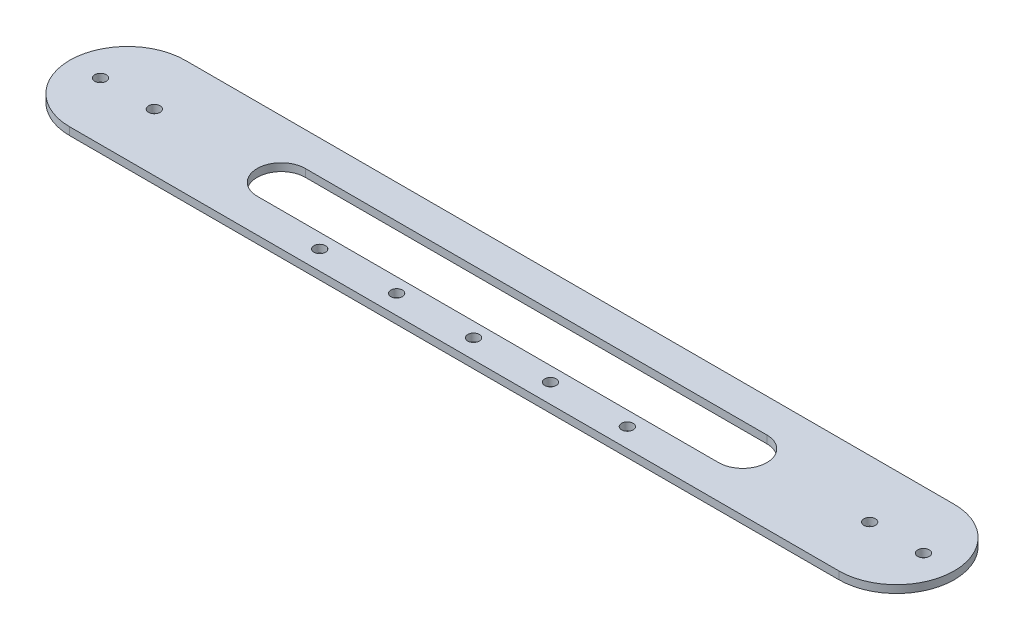
ISO-10303-21;
HEADER;
FILE_DESCRIPTION(('STEP AP214'),'2;1');
FILE_NAME('part.step','',(''),(''),'','','');
FILE_SCHEMA(('AUTOMOTIVE_DESIGN { 1 0 10303 214 1 1 1 1 }'));
ENDSEC;
DATA;
#1=APPLICATION_CONTEXT('core data for automotive mechanical design processes');
#2=APPLICATION_PROTOCOL_DEFINITION('international standard','automotive_design',2000,#1);
#3=PRODUCT_CONTEXT('',#1,'mechanical');
#4=PRODUCT('Part','Part','',(#3));
#5=PRODUCT_RELATED_PRODUCT_CATEGORY('part','',(#4));
#6=PRODUCT_DEFINITION_FORMATION('','',#4);
#7=PRODUCT_DEFINITION_CONTEXT('part definition',#1,'design');
#8=PRODUCT_DEFINITION('design','',#6,#7);
#9=PRODUCT_DEFINITION_SHAPE('','',#8);
#10=(LENGTH_UNIT() NAMED_UNIT(*) SI_UNIT(.MILLI.,.METRE.));
#11=(NAMED_UNIT(*) PLANE_ANGLE_UNIT() SI_UNIT($,.RADIAN.));
#12=(NAMED_UNIT(*) SI_UNIT($,.STERADIAN.) SOLID_ANGLE_UNIT());
#13=UNCERTAINTY_MEASURE_WITH_UNIT(LENGTH_MEASURE(1.E-05),#10,'distance_accuracy_value','');
#14=(GEOMETRIC_REPRESENTATION_CONTEXT(3) GLOBAL_UNCERTAINTY_ASSIGNED_CONTEXT((#13)) GLOBAL_UNIT_ASSIGNED_CONTEXT((#10,
#11,#12)) REPRESENTATION_CONTEXT('',''));
#15=CARTESIAN_POINT('',(0.,0.,0.));
#16=DIRECTION('',(0.,0.,1.));
#17=DIRECTION('',(1.,0.,0.));
#18=AXIS2_PLACEMENT_3D('',#15,#16,#17);
#19=CARTESIAN_POINT('',(-100.,2.,0.));
#20=DIRECTION('',(0.,-1.,0.));
#21=DIRECTION('',(0.,0.,-1.));
#22=AXIS2_PLACEMENT_3D('',#19,#20,#21);
#23=CYLINDRICAL_SURFACE('',#22,15.);
#24=CARTESIAN_POINT('',(-100.,0.,0.));
#25=DIRECTION('',(0.,1.,0.));
#26=DIRECTION('',(0.,0.,1.));
#27=AXIS2_PLACEMENT_3D('',#24,#25,#26);
#28=CIRCLE('',#27,15.);
#29=CARTESIAN_POINT('',(-100.,0.,-15.));
#30=VERTEX_POINT('',#29);
#31=CARTESIAN_POINT('',(-100.,0.,15.));
#32=VERTEX_POINT('',#31);
#33=EDGE_CURVE('E219',#30,#32,#28,.T.);
#34=ORIENTED_EDGE('',*,*,#33,.T.);
#35=DIRECTION('',(0.,-1.,0.));
#36=VECTOR('',#35,1.);
#37=CARTESIAN_POINT('',(-100.,2.,15.));
#38=LINE('',#37,#36);
#39=CARTESIAN_POINT('',(-100.,2.,15.));
#40=VERTEX_POINT('',#39);
#41=EDGE_CURVE('E11',#40,#32,#38,.T.);
#42=ORIENTED_EDGE('',*,*,#41,.F.);
#43=CARTESIAN_POINT('',(-100.,2.,0.));
#44=DIRECTION('',(0.,1.,0.));
#45=DIRECTION('',(0.,0.,1.));
#46=AXIS2_PLACEMENT_3D('',#43,#44,#45);
#47=CIRCLE('',#46,15.);
#48=CARTESIAN_POINT('',(-100.,2.,-15.));
#49=VERTEX_POINT('',#48);
#50=EDGE_CURVE('E204',#49,#40,#47,.T.);
#51=ORIENTED_EDGE('',*,*,#50,.F.);
#52=DIRECTION('',(0.,-1.,0.));
#53=VECTOR('',#52,1.);
#54=CARTESIAN_POINT('',(-100.,2.,-15.));
#55=LINE('',#54,#53);
#56=EDGE_CURVE('E218',#49,#30,#55,.T.);
#57=ORIENTED_EDGE('',*,*,#56,.T.);
#58=EDGE_LOOP('',(#34,#42,#51,#57));
#59=FACE_BOUND('',#58,.T.);
#60=ADVANCED_FACE('F43',(#59),#23,.T.);
#61=CARTESIAN_POINT('',(-100.,2.,15.));
#62=DIRECTION('',(0.,0.,-1.));
#63=DIRECTION('',(-1.,0.,0.));
#64=AXIS2_PLACEMENT_3D('',#61,#62,#63);
#65=PLANE('',#64);
#66=DIRECTION('',(1.,0.,0.));
#67=VECTOR('',#66,1.);
#68=CARTESIAN_POINT('',(-100.,0.,15.));
#69=LINE('',#68,#67);
#70=CARTESIAN_POINT('',(100.,0.,15.));
#71=VERTEX_POINT('',#70);
#72=EDGE_CURVE('E223',#32,#71,#69,.T.);
#73=ORIENTED_EDGE('',*,*,#72,.T.);
#74=DIRECTION('',(0.,-1.,0.));
#75=VECTOR('',#74,1.);
#76=CARTESIAN_POINT('',(100.,2.,15.));
#77=LINE('',#76,#75);
#78=CARTESIAN_POINT('',(100.,2.,15.));
#79=VERTEX_POINT('',#78);
#80=EDGE_CURVE('E51',#79,#71,#77,.T.);
#81=ORIENTED_EDGE('',*,*,#80,.F.);
#82=DIRECTION('',(1.,0.,0.));
#83=VECTOR('',#82,1.);
#84=CARTESIAN_POINT('',(-100.,2.,15.));
#85=LINE('',#84,#83);
#86=EDGE_CURVE('E208',#40,#79,#85,.T.);
#87=ORIENTED_EDGE('',*,*,#86,.F.);
#88=ORIENTED_EDGE('',*,*,#41,.T.);
#89=EDGE_LOOP('',(#73,#81,#87,#88));
#90=FACE_BOUND('',#89,.T.);
#91=ADVANCED_FACE('F258',(#90),#65,.F.);
#92=CARTESIAN_POINT('',(100.,2.,0.));
#93=DIRECTION('',(0.,-1.,0.));
#94=DIRECTION('',(0.,0.,-1.));
#95=AXIS2_PLACEMENT_3D('',#92,#93,#94);
#96=CYLINDRICAL_SURFACE('',#95,15.);
#97=CARTESIAN_POINT('',(100.,0.,0.));
#98=DIRECTION('',(0.,1.,0.));
#99=DIRECTION('',(0.,0.,1.));
#100=AXIS2_PLACEMENT_3D('',#97,#98,#99);
#101=CIRCLE('',#100,15.);
#102=CARTESIAN_POINT('',(100.,0.,-15.));
#103=VERTEX_POINT('',#102);
#104=EDGE_CURVE('E227',#71,#103,#101,.T.);
#105=ORIENTED_EDGE('',*,*,#104,.T.);
#106=DIRECTION('',(0.,-1.,0.));
#107=VECTOR('',#106,1.);
#108=CARTESIAN_POINT('',(100.,2.,-15.));
#109=LINE('',#108,#107);
#110=CARTESIAN_POINT('',(100.,2.,-15.));
#111=VERTEX_POINT('',#110);
#112=EDGE_CURVE('E235',#111,#103,#109,.T.);
#113=ORIENTED_EDGE('',*,*,#112,.F.);
#114=CARTESIAN_POINT('',(100.,2.,0.));
#115=DIRECTION('',(0.,1.,0.));
#116=DIRECTION('',(0.,0.,1.));
#117=AXIS2_PLACEMENT_3D('',#114,#115,#116);
#118=CIRCLE('',#117,15.);
#119=EDGE_CURVE('E212',#79,#111,#118,.T.);
#120=ORIENTED_EDGE('',*,*,#119,.F.);
#121=ORIENTED_EDGE('',*,*,#80,.T.);
#122=EDGE_LOOP('',(#105,#113,#120,#121));
#123=FACE_BOUND('',#122,.T.);
#124=ADVANCED_FACE('F244',(#123),#96,.T.);
#125=CARTESIAN_POINT('',(-100.,2.,-15.));
#126=DIRECTION('',(0.,0.,1.));
#127=DIRECTION('',(1.,0.,0.));
#128=AXIS2_PLACEMENT_3D('',#125,#126,#127);
#129=PLANE('',#128);
#130=DIRECTION('',(-1.,0.,0.));
#131=VECTOR('',#130,1.);
#132=CARTESIAN_POINT('',(-100.,0.,-15.));
#133=LINE('',#132,#131);
#134=EDGE_CURVE('E209',#103,#30,#133,.T.);
#135=ORIENTED_EDGE('',*,*,#134,.T.);
#136=ORIENTED_EDGE('',*,*,#56,.F.);
#137=DIRECTION('',(-1.,0.,0.));
#138=VECTOR('',#137,1.);
#139=CARTESIAN_POINT('',(-100.,2.,-15.));
#140=LINE('',#139,#138);
#141=EDGE_CURVE('E215',#111,#49,#140,.T.);
#142=ORIENTED_EDGE('',*,*,#141,.F.);
#143=ORIENTED_EDGE('',*,*,#112,.T.);
#144=EDGE_LOOP('',(#135,#136,#142,#143));
#145=FACE_BOUND('',#144,.T.);
#146=ADVANCED_FACE('F253',(#145),#129,.F.);
#147=CARTESIAN_POINT('',(-100.,2.,0.));
#148=DIRECTION('',(0.,1.,0.));
#149=DIRECTION('',(0.,0.,1.));
#150=AXIS2_PLACEMENT_3D('',#147,#148,#149);
#151=PLANE('',#150);
#152=CARTESIAN_POINT('',(-107.,2.,0.));
#153=DIRECTION('',(0.,1.,0.));
#154=DIRECTION('',(0.,0.,1.));
#155=AXIS2_PLACEMENT_3D('',#152,#153,#154);
#156=CIRCLE('',#155,1.5);
#157=CARTESIAN_POINT('',(-107.,2.,1.5));
#158=VERTEX_POINT('',#157);
#159=EDGE_CURVE('E159',#158,#158,#156,.T.);
#160=ORIENTED_EDGE('',*,*,#159,.F.);
#161=EDGE_LOOP('',(#160));
#162=FACE_BOUND('',#161,.T.);
#163=CARTESIAN_POINT('',(-40.,2.,10.));
#164=DIRECTION('',(0.,1.,0.));
#165=DIRECTION('',(0.,0.,1.));
#166=AXIS2_PLACEMENT_3D('',#163,#164,#165);
#167=CIRCLE('',#166,1.5);
#168=CARTESIAN_POINT('',(-40.,2.,11.5));
#169=VERTEX_POINT('',#168);
#170=EDGE_CURVE('E189',#169,#169,#167,.T.);
#171=ORIENTED_EDGE('',*,*,#170,.F.);
#172=EDGE_LOOP('',(#171));
#173=FACE_BOUND('',#172,.T.);
#174=CARTESIAN_POINT('',(0.,2.,10.));
#175=DIRECTION('',(0.,1.,0.));
#176=DIRECTION('',(0.,0.,1.));
#177=AXIS2_PLACEMENT_3D('',#174,#175,#176);
#178=CIRCLE('',#177,1.5);
#179=CARTESIAN_POINT('',(0.,2.,11.5));
#180=VERTEX_POINT('',#179);
#181=EDGE_CURVE('E116',#180,#180,#178,.T.);
#182=ORIENTED_EDGE('',*,*,#181,.F.);
#183=EDGE_LOOP('',(#182));
#184=FACE_BOUND('',#183,.T.);
#185=CARTESIAN_POINT('',(20.,2.,10.));
#186=DIRECTION('',(0.,1.,0.));
#187=DIRECTION('',(0.,0.,1.));
#188=AXIS2_PLACEMENT_3D('',#185,#186,#187);
#189=CIRCLE('',#188,1.5);
#190=CARTESIAN_POINT('',(20.,2.,11.5));
#191=VERTEX_POINT('',#190);
#192=EDGE_CURVE('E197',#191,#191,#189,.T.);
#193=ORIENTED_EDGE('',*,*,#192,.F.);
#194=EDGE_LOOP('',(#193));
#195=FACE_BOUND('',#194,.T.);
#196=CARTESIAN_POINT('',(40.,2.,9.99999999999999));
#197=DIRECTION('',(0.,1.,0.));
#198=DIRECTION('',(0.,0.,1.));
#199=AXIS2_PLACEMENT_3D('',#196,#197,#198);
#200=CIRCLE('',#199,1.5);
#201=CARTESIAN_POINT('',(40.,2.,11.5));
#202=VERTEX_POINT('',#201);
#203=EDGE_CURVE('E172',#202,#202,#200,.T.);
#204=ORIENTED_EDGE('',*,*,#203,.F.);
#205=EDGE_LOOP('',(#204));
#206=FACE_BOUND('',#205,.T.);
#207=CARTESIAN_POINT('',(-20.,2.,10.));
#208=DIRECTION('',(0.,1.,0.));
#209=DIRECTION('',(0.,0.,1.));
#210=AXIS2_PLACEMENT_3D('',#207,#208,#209);
#211=CIRCLE('',#210,1.5);
#212=CARTESIAN_POINT('',(-20.,2.,11.5));
#213=VERTEX_POINT('',#212);
#214=EDGE_CURVE('E181',#213,#213,#211,.T.);
#215=ORIENTED_EDGE('',*,*,#214,.F.);
#216=EDGE_LOOP('',(#215));
#217=FACE_BOUND('',#216,.T.);
#218=CARTESIAN_POINT('',(-93.,2.,0.));
#219=DIRECTION('',(0.,1.,0.));
#220=DIRECTION('',(0.,0.,1.));
#221=AXIS2_PLACEMENT_3D('',#218,#219,#220);
#222=CIRCLE('',#221,1.5);
#223=CARTESIAN_POINT('',(-93.,2.,1.5));
#224=VERTEX_POINT('',#223);
#225=EDGE_CURVE('E155',#224,#224,#222,.T.);
#226=ORIENTED_EDGE('',*,*,#225,.F.);
#227=EDGE_LOOP('',(#226));
#228=FACE_BOUND('',#227,.T.);
#229=CARTESIAN_POINT('',(107.,2.,0.));
#230=DIRECTION('',(0.,1.,0.));
#231=DIRECTION('',(0.,0.,-1.));
#232=AXIS2_PLACEMENT_3D('',#229,#230,#231);
#233=CIRCLE('',#232,1.5);
#234=CARTESIAN_POINT('',(107.,2.,-1.5));
#235=VERTEX_POINT('',#234);
#236=EDGE_CURVE('E164',#235,#235,#233,.T.);
#237=ORIENTED_EDGE('',*,*,#236,.F.);
#238=EDGE_LOOP('',(#237));
#239=FACE_BOUND('',#238,.T.);
#240=CARTESIAN_POINT('',(93.,2.,0.));
#241=DIRECTION('',(0.,1.,0.));
#242=DIRECTION('',(0.,0.,-1.));
#243=AXIS2_PLACEMENT_3D('',#240,#241,#242);
#244=CIRCLE('',#243,1.5);
#245=CARTESIAN_POINT('',(93.,2.,-1.5));
#246=VERTEX_POINT('',#245);
#247=EDGE_CURVE('E138',#246,#246,#244,.T.);
#248=ORIENTED_EDGE('',*,*,#247,.F.);
#249=EDGE_LOOP('',(#248));
#250=FACE_BOUND('',#249,.T.);
#251=CARTESIAN_POINT('',(-60.,2.,0.));
#252=DIRECTION('',(0.,1.,0.));
#253=DIRECTION('',(0.,0.,1.));
#254=AXIS2_PLACEMENT_3D('',#251,#252,#253);
#255=CIRCLE('',#254,6.25);
#256=CARTESIAN_POINT('',(-60.,2.,-6.25000000000001));
#257=VERTEX_POINT('',#256);
#258=CARTESIAN_POINT('',(-60.,2.,6.24999999999999));
#259=VERTEX_POINT('',#258);
#260=EDGE_CURVE('E58',#257,#259,#255,.T.);
#261=ORIENTED_EDGE('',*,*,#260,.F.);
#262=DIRECTION('',(-1.,0.,0.));
#263=VECTOR('',#262,1.);
#264=CARTESIAN_POINT('',(-60.,2.,-6.25000000000001));
#265=LINE('',#264,#263);
#266=CARTESIAN_POINT('',(60.,2.,-6.25000000000001));
#267=VERTEX_POINT('',#266);
#268=EDGE_CURVE('E119',#267,#257,#265,.T.);
#269=ORIENTED_EDGE('',*,*,#268,.F.);
#270=CARTESIAN_POINT('',(60.,2.,0.));
#271=DIRECTION('',(0.,1.,0.));
#272=DIRECTION('',(0.,0.,1.));
#273=AXIS2_PLACEMENT_3D('',#270,#271,#272);
#274=CIRCLE('',#273,6.25);
#275=CARTESIAN_POINT('',(60.,2.,6.24999999999998));
#276=VERTEX_POINT('',#275);
#277=EDGE_CURVE('E125',#276,#267,#274,.T.);
#278=ORIENTED_EDGE('',*,*,#277,.F.);
#279=DIRECTION('',(1.,0.,0.));
#280=VECTOR('',#279,1.);
#281=CARTESIAN_POINT('',(-60.,2.,6.24999999999999));
#282=LINE('',#281,#280);
#283=EDGE_CURVE('E131',#259,#276,#282,.T.);
#284=ORIENTED_EDGE('',*,*,#283,.F.);
#285=EDGE_LOOP('',(#261,#269,#278,#284));
#286=FACE_BOUND('',#285,.T.);
#287=ORIENTED_EDGE('',*,*,#50,.T.);
#288=ORIENTED_EDGE('',*,*,#86,.T.);
#289=ORIENTED_EDGE('',*,*,#119,.T.);
#290=ORIENTED_EDGE('',*,*,#141,.T.);
#291=EDGE_LOOP('',(#287,#288,#289,#290));
#292=FACE_BOUND('',#291,.T.);
#293=ADVANCED_FACE('F128',(#162,#173,#184,#195,#206,#217,#228,#239,#250,#286,#292),#151,.T.);
#294=CARTESIAN_POINT('',(-100.,0.,0.));
#295=DIRECTION('',(0.,1.,0.));
#296=DIRECTION('',(0.,0.,1.));
#297=AXIS2_PLACEMENT_3D('',#294,#295,#296);
#298=PLANE('',#297);
#299=CARTESIAN_POINT('',(-107.,0.,0.));
#300=DIRECTION('',(0.,1.,0.));
#301=DIRECTION('',(0.,0.,1.));
#302=AXIS2_PLACEMENT_3D('',#299,#300,#301);
#303=CIRCLE('',#302,1.5);
#304=CARTESIAN_POINT('',(-107.,0.,1.5));
#305=VERTEX_POINT('',#304);
#306=EDGE_CURVE('E224',#305,#305,#303,.T.);
#307=ORIENTED_EDGE('',*,*,#306,.T.);
#308=EDGE_LOOP('',(#307));
#309=FACE_BOUND('',#308,.T.);
#310=CARTESIAN_POINT('',(-40.,0.,10.));
#311=DIRECTION('',(0.,1.,0.));
#312=DIRECTION('',(0.,0.,1.));
#313=AXIS2_PLACEMENT_3D('',#310,#311,#312);
#314=CIRCLE('',#313,1.5);
#315=CARTESIAN_POINT('',(-40.,0.,11.5));
#316=VERTEX_POINT('',#315);
#317=EDGE_CURVE('E335',#316,#316,#314,.T.);
#318=ORIENTED_EDGE('',*,*,#317,.T.);
#319=EDGE_LOOP('',(#318));
#320=FACE_BOUND('',#319,.T.);
#321=CARTESIAN_POINT('',(0.,0.,10.));
#322=DIRECTION('',(0.,1.,0.));
#323=DIRECTION('',(0.,0.,1.));
#324=AXIS2_PLACEMENT_3D('',#321,#322,#323);
#325=CIRCLE('',#324,1.5);
#326=CARTESIAN_POINT('',(0.,0.,11.5));
#327=VERTEX_POINT('',#326);
#328=EDGE_CURVE('E193',#327,#327,#325,.T.);
#329=ORIENTED_EDGE('',*,*,#328,.T.);
#330=EDGE_LOOP('',(#329));
#331=FACE_BOUND('',#330,.T.);
#332=CARTESIAN_POINT('',(20.,0.,10.));
#333=DIRECTION('',(0.,1.,0.));
#334=DIRECTION('',(0.,0.,1.));
#335=AXIS2_PLACEMENT_3D('',#332,#333,#334);
#336=CIRCLE('',#335,1.5);
#337=CARTESIAN_POINT('',(20.,0.,11.5));
#338=VERTEX_POINT('',#337);
#339=EDGE_CURVE('E176',#338,#338,#336,.T.);
#340=ORIENTED_EDGE('',*,*,#339,.T.);
#341=EDGE_LOOP('',(#340));
#342=FACE_BOUND('',#341,.T.);
#343=CARTESIAN_POINT('',(40.,0.,9.99999999999999));
#344=DIRECTION('',(0.,1.,0.));
#345=DIRECTION('',(0.,0.,1.));
#346=AXIS2_PLACEMENT_3D('',#343,#344,#345);
#347=CIRCLE('',#346,1.5);
#348=CARTESIAN_POINT('',(40.,0.,11.5));
#349=VERTEX_POINT('',#348);
#350=EDGE_CURVE('E177',#349,#349,#347,.T.);
#351=ORIENTED_EDGE('',*,*,#350,.T.);
#352=EDGE_LOOP('',(#351));
#353=FACE_BOUND('',#352,.T.);
#354=CARTESIAN_POINT('',(-20.,0.,10.));
#355=DIRECTION('',(0.,1.,0.));
#356=DIRECTION('',(0.,0.,1.));
#357=AXIS2_PLACEMENT_3D('',#354,#355,#356);
#358=CIRCLE('',#357,1.5);
#359=CARTESIAN_POINT('',(-20.,0.,11.5));
#360=VERTEX_POINT('',#359);
#361=EDGE_CURVE('E185',#360,#360,#358,.T.);
#362=ORIENTED_EDGE('',*,*,#361,.T.);
#363=EDGE_LOOP('',(#362));
#364=FACE_BOUND('',#363,.T.);
#365=CARTESIAN_POINT('',(-93.,0.,0.));
#366=DIRECTION('',(0.,1.,0.));
#367=DIRECTION('',(0.,0.,1.));
#368=AXIS2_PLACEMENT_3D('',#365,#366,#367);
#369=CIRCLE('',#368,1.5);
#370=CARTESIAN_POINT('',(-93.,0.,1.5));
#371=VERTEX_POINT('',#370);
#372=EDGE_CURVE('E160',#371,#371,#369,.T.);
#373=ORIENTED_EDGE('',*,*,#372,.T.);
#374=EDGE_LOOP('',(#373));
#375=FACE_BOUND('',#374,.T.);
#376=CARTESIAN_POINT('',(107.,0.,0.));
#377=DIRECTION('',(0.,1.,0.));
#378=DIRECTION('',(0.,0.,-1.));
#379=AXIS2_PLACEMENT_3D('',#376,#377,#378);
#380=CIRCLE('',#379,1.5);
#381=CARTESIAN_POINT('',(107.,0.,-1.5));
#382=VERTEX_POINT('',#381);
#383=EDGE_CURVE('E168',#382,#382,#380,.T.);
#384=ORIENTED_EDGE('',*,*,#383,.T.);
#385=EDGE_LOOP('',(#384));
#386=FACE_BOUND('',#385,.T.);
#387=CARTESIAN_POINT('',(93.,0.,0.));
#388=DIRECTION('',(0.,1.,0.));
#389=DIRECTION('',(0.,0.,-1.));
#390=AXIS2_PLACEMENT_3D('',#387,#388,#389);
#391=CIRCLE('',#390,1.5);
#392=CARTESIAN_POINT('',(93.,0.,-1.5));
#393=VERTEX_POINT('',#392);
#394=EDGE_CURVE('E133',#393,#393,#391,.T.);
#395=ORIENTED_EDGE('',*,*,#394,.T.);
#396=EDGE_LOOP('',(#395));
#397=FACE_BOUND('',#396,.T.);
#398=DIRECTION('',(-1.,0.,0.));
#399=VECTOR('',#398,1.);
#400=CARTESIAN_POINT('',(-60.,0.,-6.25000000000001));
#401=LINE('',#400,#399);
#402=CARTESIAN_POINT('',(60.,0.,-6.25000000000001));
#403=VERTEX_POINT('',#402);
#404=CARTESIAN_POINT('',(-60.,0.,-6.25000000000001));
#405=VERTEX_POINT('',#404);
#406=EDGE_CURVE('E143',#403,#405,#401,.T.);
#407=ORIENTED_EDGE('',*,*,#406,.T.);
#408=CARTESIAN_POINT('',(-60.,0.,0.));
#409=DIRECTION('',(0.,1.,0.));
#410=DIRECTION('',(0.,0.,1.));
#411=AXIS2_PLACEMENT_3D('',#408,#409,#410);
#412=CIRCLE('',#411,6.25);
#413=CARTESIAN_POINT('',(-60.,0.,6.24999999999999));
#414=VERTEX_POINT('',#413);
#415=EDGE_CURVE('E110',#405,#414,#412,.T.);
#416=ORIENTED_EDGE('',*,*,#415,.T.);
#417=DIRECTION('',(1.,0.,0.));
#418=VECTOR('',#417,1.);
#419=CARTESIAN_POINT('',(-60.,0.,6.24999999999999));
#420=LINE('',#419,#418);
#421=CARTESIAN_POINT('',(60.,0.,6.24999999999999));
#422=VERTEX_POINT('',#421);
#423=EDGE_CURVE('E149',#414,#422,#420,.T.);
#424=ORIENTED_EDGE('',*,*,#423,.T.);
#425=CARTESIAN_POINT('',(60.,0.,0.));
#426=DIRECTION('',(0.,1.,0.));
#427=DIRECTION('',(0.,0.,1.));
#428=AXIS2_PLACEMENT_3D('',#425,#426,#427);
#429=CIRCLE('',#428,6.25);
#430=EDGE_CURVE('E66',#422,#403,#429,.T.);
#431=ORIENTED_EDGE('',*,*,#430,.T.);
#432=EDGE_LOOP('',(#407,#416,#424,#431));
#433=FACE_BOUND('',#432,.T.);
#434=ORIENTED_EDGE('',*,*,#33,.F.);
#435=ORIENTED_EDGE('',*,*,#134,.F.);
#436=ORIENTED_EDGE('',*,*,#104,.F.);
#437=ORIENTED_EDGE('',*,*,#72,.F.);
#438=EDGE_LOOP('',(#434,#435,#436,#437));
#439=FACE_BOUND('',#438,.T.);
#440=ADVANCED_FACE('F250',(#309,#320,#331,#342,#353,#364,#375,#386,#397,#433,#439),#298,.F.);
#441=CARTESIAN_POINT('',(-60.,0.,0.));
#442=DIRECTION('',(0.,1.,0.));
#443=DIRECTION('',(0.,0.,1.));
#444=AXIS2_PLACEMENT_3D('',#441,#442,#443);
#445=CYLINDRICAL_SURFACE('',#444,6.25);
#446=ORIENTED_EDGE('',*,*,#260,.T.);
#447=DIRECTION('',(0.,1.,0.));
#448=VECTOR('',#447,1.);
#449=CARTESIAN_POINT('',(-60.,0.,6.24999999999999));
#450=LINE('',#449,#448);
#451=EDGE_CURVE('E146',#414,#259,#450,.T.);
#452=ORIENTED_EDGE('',*,*,#451,.F.);
#453=ORIENTED_EDGE('',*,*,#415,.F.);
#454=DIRECTION('',(0.,1.,0.));
#455=VECTOR('',#454,1.);
#456=CARTESIAN_POINT('',(-60.,0.,-6.25000000000001));
#457=LINE('',#456,#455);
#458=EDGE_CURVE('E106',#405,#257,#457,.T.);
#459=ORIENTED_EDGE('',*,*,#458,.T.);
#460=EDGE_LOOP('',(#446,#452,#453,#459));
#461=FACE_BOUND('',#460,.T.);
#462=ADVANCED_FACE('F108',(#461),#445,.F.);
#463=CARTESIAN_POINT('',(-60.,0.,-6.25000000000001));
#464=DIRECTION('',(0.,0.,-1.));
#465=DIRECTION('',(-1.,0.,0.));
#466=AXIS2_PLACEMENT_3D('',#463,#464,#465);
#467=PLANE('',#466);
#468=ORIENTED_EDGE('',*,*,#268,.T.);
#469=ORIENTED_EDGE('',*,*,#458,.F.);
#470=ORIENTED_EDGE('',*,*,#406,.F.);
#471=DIRECTION('',(0.,1.,0.));
#472=VECTOR('',#471,1.);
#473=CARTESIAN_POINT('',(60.,0.,-6.25000000000001));
#474=LINE('',#473,#472);
#475=EDGE_CURVE('E115',#403,#267,#474,.T.);
#476=ORIENTED_EDGE('',*,*,#475,.T.);
#477=EDGE_LOOP('',(#468,#469,#470,#476));
#478=FACE_BOUND('',#477,.T.);
#479=ADVANCED_FACE('F120',(#478),#467,.F.);
#480=CARTESIAN_POINT('',(60.,0.,0.));
#481=DIRECTION('',(0.,1.,0.));
#482=DIRECTION('',(0.,0.,1.));
#483=AXIS2_PLACEMENT_3D('',#480,#481,#482);
#484=CYLINDRICAL_SURFACE('',#483,6.25);
#485=ORIENTED_EDGE('',*,*,#277,.T.);
#486=ORIENTED_EDGE('',*,*,#475,.F.);
#487=ORIENTED_EDGE('',*,*,#430,.F.);
#488=DIRECTION('',(0.,1.,0.));
#489=VECTOR('',#488,1.);
#490=CARTESIAN_POINT('',(60.,0.,6.24999999999998));
#491=LINE('',#490,#489);
#492=EDGE_CURVE('E344',#422,#276,#491,.T.);
#493=ORIENTED_EDGE('',*,*,#492,.T.);
#494=EDGE_LOOP('',(#485,#486,#487,#493));
#495=FACE_BOUND('',#494,.T.);
#496=ADVANCED_FACE('F302',(#495),#484,.F.);
#497=CARTESIAN_POINT('',(-60.,0.,6.24999999999999));
#498=DIRECTION('',(0.,0.,1.));
#499=DIRECTION('',(1.,0.,0.));
#500=AXIS2_PLACEMENT_3D('',#497,#498,#499);
#501=PLANE('',#500);
#502=ORIENTED_EDGE('',*,*,#283,.T.);
#503=ORIENTED_EDGE('',*,*,#492,.F.);
#504=ORIENTED_EDGE('',*,*,#423,.F.);
#505=ORIENTED_EDGE('',*,*,#451,.T.);
#506=EDGE_LOOP('',(#502,#503,#504,#505));
#507=FACE_BOUND('',#506,.T.);
#508=ADVANCED_FACE('F305',(#507),#501,.F.);
#509=CARTESIAN_POINT('',(93.,0.,0.));
#510=DIRECTION('',(0.,1.,0.));
#511=DIRECTION('',(0.,0.,1.));
#512=AXIS2_PLACEMENT_3D('',#509,#510,#511);
#513=CYLINDRICAL_SURFACE('',#512,1.5);
#514=ORIENTED_EDGE('',*,*,#394,.F.);
#515=EDGE_LOOP('',(#514));
#516=FACE_BOUND('',#515,.T.);
#517=ORIENTED_EDGE('',*,*,#247,.T.);
#518=EDGE_LOOP('',(#517));
#519=FACE_BOUND('',#518,.T.);
#520=ADVANCED_FACE('F295',(#516,#519),#513,.F.);
#521=CARTESIAN_POINT('',(107.,0.,0.));
#522=DIRECTION('',(0.,1.,0.));
#523=DIRECTION('',(0.,0.,1.));
#524=AXIS2_PLACEMENT_3D('',#521,#522,#523);
#525=CYLINDRICAL_SURFACE('',#524,1.5);
#526=ORIENTED_EDGE('',*,*,#383,.F.);
#527=EDGE_LOOP('',(#526));
#528=FACE_BOUND('',#527,.T.);
#529=ORIENTED_EDGE('',*,*,#236,.T.);
#530=EDGE_LOOP('',(#529));
#531=FACE_BOUND('',#530,.T.);
#532=ADVANCED_FACE('F292',(#528,#531),#525,.F.);
#533=CARTESIAN_POINT('',(-93.,0.,0.));
#534=DIRECTION('',(0.,1.,0.));
#535=DIRECTION('',(0.,0.,1.));
#536=AXIS2_PLACEMENT_3D('',#533,#534,#535);
#537=CYLINDRICAL_SURFACE('',#536,1.5);
#538=ORIENTED_EDGE('',*,*,#372,.F.);
#539=EDGE_LOOP('',(#538));
#540=FACE_BOUND('',#539,.T.);
#541=ORIENTED_EDGE('',*,*,#225,.T.);
#542=EDGE_LOOP('',(#541));
#543=FACE_BOUND('',#542,.T.);
#544=ADVANCED_FACE('F287',(#540,#543),#537,.F.);
#545=CARTESIAN_POINT('',(-20.,0.,10.));
#546=DIRECTION('',(0.,1.,0.));
#547=DIRECTION('',(0.,0.,1.));
#548=AXIS2_PLACEMENT_3D('',#545,#546,#547);
#549=CYLINDRICAL_SURFACE('',#548,1.5);
#550=ORIENTED_EDGE('',*,*,#361,.F.);
#551=EDGE_LOOP('',(#550));
#552=FACE_BOUND('',#551,.T.);
#553=ORIENTED_EDGE('',*,*,#214,.T.);
#554=EDGE_LOOP('',(#553));
#555=FACE_BOUND('',#554,.T.);
#556=ADVANCED_FACE('F284',(#552,#555),#549,.F.);
#557=CARTESIAN_POINT('',(40.,0.,9.99999999999999));
#558=DIRECTION('',(0.,1.,0.));
#559=DIRECTION('',(0.,0.,1.));
#560=AXIS2_PLACEMENT_3D('',#557,#558,#559);
#561=CYLINDRICAL_SURFACE('',#560,1.5);
#562=ORIENTED_EDGE('',*,*,#350,.F.);
#563=EDGE_LOOP('',(#562));
#564=FACE_BOUND('',#563,.T.);
#565=ORIENTED_EDGE('',*,*,#203,.T.);
#566=EDGE_LOOP('',(#565));
#567=FACE_BOUND('',#566,.T.);
#568=ADVANCED_FACE('F278',(#564,#567),#561,.F.);
#569=CARTESIAN_POINT('',(20.,0.,10.));
#570=DIRECTION('',(0.,1.,0.));
#571=DIRECTION('',(0.,0.,1.));
#572=AXIS2_PLACEMENT_3D('',#569,#570,#571);
#573=CYLINDRICAL_SURFACE('',#572,1.5);
#574=ORIENTED_EDGE('',*,*,#339,.F.);
#575=EDGE_LOOP('',(#574));
#576=FACE_BOUND('',#575,.T.);
#577=ORIENTED_EDGE('',*,*,#192,.T.);
#578=EDGE_LOOP('',(#577));
#579=FACE_BOUND('',#578,.T.);
#580=ADVANCED_FACE('F274',(#576,#579),#573,.F.);
#581=CARTESIAN_POINT('',(0.,0.,10.));
#582=DIRECTION('',(0.,1.,0.));
#583=DIRECTION('',(0.,0.,1.));
#584=AXIS2_PLACEMENT_3D('',#581,#582,#583);
#585=CYLINDRICAL_SURFACE('',#584,1.5);
#586=ORIENTED_EDGE('',*,*,#328,.F.);
#587=EDGE_LOOP('',(#586));
#588=FACE_BOUND('',#587,.T.);
#589=ORIENTED_EDGE('',*,*,#181,.T.);
#590=EDGE_LOOP('',(#589));
#591=FACE_BOUND('',#590,.T.);
#592=ADVANCED_FACE('F277',(#588,#591),#585,.F.);
#593=CARTESIAN_POINT('',(-40.,0.,10.));
#594=DIRECTION('',(0.,1.,0.));
#595=DIRECTION('',(0.,0.,1.));
#596=AXIS2_PLACEMENT_3D('',#593,#594,#595);
#597=CYLINDRICAL_SURFACE('',#596,1.5);
#598=ORIENTED_EDGE('',*,*,#317,.F.);
#599=EDGE_LOOP('',(#598));
#600=FACE_BOUND('',#599,.T.);
#601=ORIENTED_EDGE('',*,*,#170,.T.);
#602=EDGE_LOOP('',(#601));
#603=FACE_BOUND('',#602,.T.);
#604=ADVANCED_FACE('F282',(#600,#603),#597,.F.);
#605=CARTESIAN_POINT('',(-107.,0.,0.));
#606=DIRECTION('',(0.,1.,0.));
#607=DIRECTION('',(0.,0.,1.));
#608=AXIS2_PLACEMENT_3D('',#605,#606,#607);
#609=CYLINDRICAL_SURFACE('',#608,1.5);
#610=ORIENTED_EDGE('',*,*,#306,.F.);
#611=EDGE_LOOP('',(#610));
#612=FACE_BOUND('',#611,.T.);
#613=ORIENTED_EDGE('',*,*,#159,.T.);
#614=EDGE_LOOP('',(#613));
#615=FACE_BOUND('',#614,.T.);
#616=ADVANCED_FACE('F316',(#612,#615),#609,.F.);
#617=CLOSED_SHELL('',(#60,#91,#124,#146,#293,#440,#462,#479,#496,#508,#520,#532,#544,#556,#568,
#580,#592,#604,#616));
#618=MANIFOLD_SOLID_BREP('B2',#617);
#619=ADVANCED_BREP_SHAPE_REPRESENTATION('',(#18,#618),#14);
#620=SHAPE_DEFINITION_REPRESENTATION(#9,#619);
ENDSEC;
END-ISO-10303-21;
